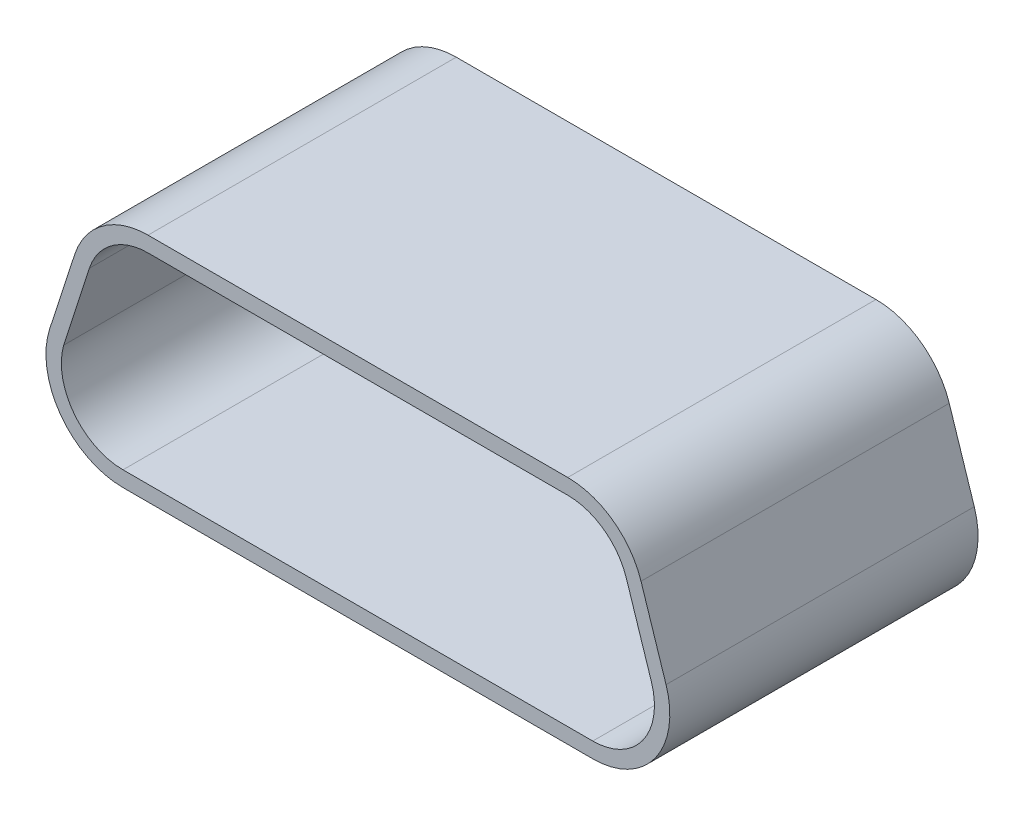
ISO-10303-21;
HEADER;
FILE_DESCRIPTION(('STEP AP214'),'2;1');
FILE_NAME('part.step','',(''),(''),'','','');
FILE_SCHEMA(('AUTOMOTIVE_DESIGN { 1 0 10303 214 1 1 1 1 }'));
ENDSEC;
DATA;
#1=APPLICATION_CONTEXT('core data for automotive mechanical design processes');
#2=APPLICATION_PROTOCOL_DEFINITION('international standard','automotive_design',2000,#1);
#3=PRODUCT_CONTEXT('',#1,'mechanical');
#4=PRODUCT('Part','Part','',(#3));
#5=PRODUCT_RELATED_PRODUCT_CATEGORY('part','',(#4));
#6=PRODUCT_DEFINITION_FORMATION('','',#4);
#7=PRODUCT_DEFINITION_CONTEXT('part definition',#1,'design');
#8=PRODUCT_DEFINITION('design','',#6,#7);
#9=PRODUCT_DEFINITION_SHAPE('','',#8);
#10=(LENGTH_UNIT() NAMED_UNIT(*) SI_UNIT(.MILLI.,.METRE.));
#11=(NAMED_UNIT(*) PLANE_ANGLE_UNIT() SI_UNIT($,.RADIAN.));
#12=(NAMED_UNIT(*) SI_UNIT($,.STERADIAN.) SOLID_ANGLE_UNIT());
#13=UNCERTAINTY_MEASURE_WITH_UNIT(LENGTH_MEASURE(1.E-05),#10,'distance_accuracy_value','');
#14=(GEOMETRIC_REPRESENTATION_CONTEXT(3) GLOBAL_UNCERTAINTY_ASSIGNED_CONTEXT((#13)) GLOBAL_UNIT_ASSIGNED_CONTEXT((#10,
#11,#12)) REPRESENTATION_CONTEXT('',''));
#15=CARTESIAN_POINT('',(0.,0.,0.));
#16=DIRECTION('',(0.,0.,1.));
#17=DIRECTION('',(1.,0.,0.));
#18=AXIS2_PLACEMENT_3D('',#15,#16,#17);
#19=CARTESIAN_POINT('',(-2.64724610187082,15.,20.));
#20=DIRECTION('',(0.,-1.,0.));
#21=DIRECTION('',(0.,0.,-1.));
#22=AXIS2_PLACEMENT_3D('',#19,#20,#21);
#23=PLANE('',#22);
#24=DIRECTION('',(-1.,0.,0.));
#25=VECTOR('',#24,1.);
#26=CARTESIAN_POINT('',(-2.64724610187082,15.,0.));
#27=LINE('',#26,#25);
#28=CARTESIAN_POINT('',(28.2190362234267,15.,0.));
#29=VERTEX_POINT('',#28);
#30=CARTESIAN_POINT('',(0.985466538155962,15.,0.));
#31=VERTEX_POINT('',#30);
#32=EDGE_CURVE('E201',#29,#31,#27,.T.);
#33=ORIENTED_EDGE('',*,*,#32,.T.);
#34=DIRECTION('',(0.,0.,-1.));
#35=VECTOR('',#34,1.);
#36=CARTESIAN_POINT('',(0.985466538155962,15.,20.));
#37=LINE('',#36,#35);
#38=CARTESIAN_POINT('',(0.985466538155962,15.,20.));
#39=VERTEX_POINT('',#38);
#40=EDGE_CURVE('E252',#31,#39,#37,.F.);
#41=ORIENTED_EDGE('',*,*,#40,.T.);
#42=DIRECTION('',(-1.,0.,0.));
#43=VECTOR('',#42,1.);
#44=CARTESIAN_POINT('',(-2.64724610187082,15.,20.));
#45=LINE('',#44,#43);
#46=CARTESIAN_POINT('',(28.2190362234267,15.,20.));
#47=VERTEX_POINT('',#46);
#48=EDGE_CURVE('E216',#47,#39,#45,.T.);
#49=ORIENTED_EDGE('',*,*,#48,.F.);
#50=DIRECTION('',(0.,0.,-1.));
#51=VECTOR('',#50,1.);
#52=CARTESIAN_POINT('',(28.2190362234267,15.,20.));
#53=LINE('',#52,#51);
#54=EDGE_CURVE('E249',#47,#29,#53,.T.);
#55=ORIENTED_EDGE('',*,*,#54,.T.);
#56=EDGE_LOOP('',(#33,#41,#49,#55));
#57=FACE_BOUND('',#56,.T.);
#58=ADVANCED_FACE('F33',(#57),#23,.F.);
#59=CARTESIAN_POINT('',(-5.89644306419994,5.,20.));
#60=DIRECTION('',(0.951056516295152,-0.309016994374952,0.));
#61=DIRECTION('',(0.309016994374952,0.951056516295152,0.));
#62=AXIS2_PLACEMENT_3D('',#59,#60,#61);
#63=PLANE('',#62);
#64=DIRECTION('',(-0.309016994374952,-0.951056516295152,0.));
#65=VECTOR('',#64,1.);
#66=CARTESIAN_POINT('',(-5.89644306419994,5.,20.));
#67=LINE('',#66,#65);
#68=CARTESIAN_POINT('',(-3.7698160433198,11.5450849718748,20.));
#69=VERTEX_POINT('',#68);
#70=CARTESIAN_POINT('',(-5.39441452448435,6.54508497187476,20.));
#71=VERTEX_POINT('',#70);
#72=EDGE_CURVE('E220',#69,#71,#67,.T.);
#73=ORIENTED_EDGE('',*,*,#72,.F.);
#74=DIRECTION('',(0.,0.,-1.));
#75=VECTOR('',#74,1.);
#76=CARTESIAN_POINT('',(-3.7698160433198,11.5450849718748,20.));
#77=LINE('',#76,#75);
#78=CARTESIAN_POINT('',(-3.7698160433198,11.5450849718748,0.));
#79=VERTEX_POINT('',#78);
#80=EDGE_CURVE('E238',#69,#79,#77,.T.);
#81=ORIENTED_EDGE('',*,*,#80,.T.);
#82=DIRECTION('',(-0.309016994374952,-0.951056516295152,0.));
#83=VECTOR('',#82,1.);
#84=CARTESIAN_POINT('',(-5.89644306419994,5.,0.));
#85=LINE('',#84,#83);
#86=CARTESIAN_POINT('',(-5.39441452448435,6.54508497187476,0.));
#87=VERTEX_POINT('',#86);
#88=EDGE_CURVE('E229',#79,#87,#85,.T.);
#89=ORIENTED_EDGE('',*,*,#88,.T.);
#90=DIRECTION('',(0.,0.,-1.));
#91=VECTOR('',#90,1.);
#92=CARTESIAN_POINT('',(-5.39441452448435,6.54508497187476,20.));
#93=LINE('',#92,#91);
#94=EDGE_CURVE('E226',#87,#71,#93,.F.);
#95=ORIENTED_EDGE('',*,*,#94,.T.);
#96=EDGE_LOOP('',(#73,#81,#89,#95));
#97=FACE_BOUND('',#96,.T.);
#98=ADVANCED_FACE('F293',(#97),#63,.F.);
#99=CARTESIAN_POINT('',(-7.52104154536449,0.,20.));
#100=DIRECTION('',(0.,1.,0.));
#101=DIRECTION('',(0.,0.,1.));
#102=AXIS2_PLACEMENT_3D('',#99,#100,#101);
#103=PLANE('',#102);
#104=DIRECTION('',(1.,0.,0.));
#105=VECTOR('',#104,1.);
#106=CARTESIAN_POINT('',(-7.52104154536449,0.,20.));
#107=LINE('',#106,#105);
#108=CARTESIAN_POINT('',(-0.639131943008595,0.,20.));
#109=VERTEX_POINT('',#108);
#110=CARTESIAN_POINT('',(29.8436347045912,0.,20.));
#111=VERTEX_POINT('',#110);
#112=EDGE_CURVE('E223',#109,#111,#107,.T.);
#113=ORIENTED_EDGE('',*,*,#112,.F.);
#114=DIRECTION('',(0.,0.,-1.));
#115=VECTOR('',#114,1.);
#116=CARTESIAN_POINT('',(-0.639131943008593,0.,20.));
#117=LINE('',#116,#115);
#118=CARTESIAN_POINT('',(-0.639131943008595,0.,0.));
#119=VERTEX_POINT('',#118);
#120=EDGE_CURVE('E264',#109,#119,#117,.T.);
#121=ORIENTED_EDGE('',*,*,#120,.T.);
#122=DIRECTION('',(1.,0.,0.));
#123=VECTOR('',#122,1.);
#124=CARTESIAN_POINT('',(-7.52104154536449,0.,0.));
#125=LINE('',#124,#123);
#126=CARTESIAN_POINT('',(29.8436347045912,0.,0.));
#127=VERTEX_POINT('',#126);
#128=EDGE_CURVE('E232',#119,#127,#125,.T.);
#129=ORIENTED_EDGE('',*,*,#128,.T.);
#130=DIRECTION('',(0.,0.,-1.));
#131=VECTOR('',#130,1.);
#132=CARTESIAN_POINT('',(29.8436347045912,0.,20.));
#133=LINE('',#132,#131);
#134=EDGE_CURVE('E262',#127,#111,#133,.F.);
#135=ORIENTED_EDGE('',*,*,#134,.T.);
#136=EDGE_LOOP('',(#113,#121,#129,#135));
#137=FACE_BOUND('',#136,.T.);
#138=ADVANCED_FACE('F301',(#137),#103,.F.);
#139=CARTESIAN_POINT('',(36.7255443069471,0.,20.));
#140=DIRECTION('',(-0.951056516295152,-0.309016994374952,0.));
#141=DIRECTION('',(0.309016994374952,-0.951056516295152,0.));
#142=AXIS2_PLACEMENT_3D('',#139,#140,#141);
#143=PLANE('',#142);
#144=DIRECTION('',(-0.309016994374952,0.951056516295152,0.));
#145=VECTOR('',#144,1.);
#146=CARTESIAN_POINT('',(36.7255443069471,0.,0.));
#147=LINE('',#146,#145);
#148=CARTESIAN_POINT('',(34.598917286067,6.54508497187476,0.));
#149=VERTEX_POINT('',#148);
#150=CARTESIAN_POINT('',(32.9743188049024,11.5450849718748,0.));
#151=VERTEX_POINT('',#150);
#152=EDGE_CURVE('E217',#149,#151,#147,.T.);
#153=ORIENTED_EDGE('',*,*,#152,.T.);
#154=DIRECTION('',(0.,0.,-1.));
#155=VECTOR('',#154,1.);
#156=CARTESIAN_POINT('',(32.9743188049024,11.5450849718748,20.));
#157=LINE('',#156,#155);
#158=CARTESIAN_POINT('',(32.9743188049024,11.5450849718748,20.));
#159=VERTEX_POINT('',#158);
#160=EDGE_CURVE('E12',#151,#159,#157,.F.);
#161=ORIENTED_EDGE('',*,*,#160,.T.);
#162=DIRECTION('',(-0.309016994374952,0.951056516295152,0.));
#163=VECTOR('',#162,1.);
#164=CARTESIAN_POINT('',(31.8517488634535,15.,20.));
#165=LINE('',#164,#163);
#166=CARTESIAN_POINT('',(34.598917286067,6.54508497187476,20.));
#167=VERTEX_POINT('',#166);
#168=EDGE_CURVE('E213',#167,#159,#165,.T.);
#169=ORIENTED_EDGE('',*,*,#168,.F.);
#170=DIRECTION('',(0.,0.,-1.));
#171=VECTOR('',#170,1.);
#172=CARTESIAN_POINT('',(34.598917286067,6.54508497187476,20.));
#173=LINE('',#172,#171);
#174=EDGE_CURVE('E41',#167,#149,#173,.T.);
#175=ORIENTED_EDGE('',*,*,#174,.T.);
#176=EDGE_LOOP('',(#153,#161,#169,#175));
#177=FACE_BOUND('',#176,.T.);
#178=ADVANCED_FACE('F271',(#177),#143,.F.);
#179=CARTESIAN_POINT('',(0.,0.,20.));
#180=DIRECTION('',(0.,0.,1.));
#181=DIRECTION('',(1.,0.,0.));
#182=AXIS2_PLACEMENT_3D('',#179,#180,#181);
#183=PLANE('',#182);
#184=DIRECTION('',(1.,0.,0.));
#185=VECTOR('',#184,1.);
#186=CARTESIAN_POINT('',(0.,1.,20.));
#187=LINE('',#186,#185);
#188=CARTESIAN_POINT('',(-0.639131943008593,1.,20.));
#189=VERTEX_POINT('',#188);
#190=CARTESIAN_POINT('',(29.8436347045912,1.,20.));
#191=VERTEX_POINT('',#190);
#192=EDGE_CURVE('E48',#189,#191,#187,.T.);
#193=ORIENTED_EDGE('',*,*,#192,.F.);
#194=CARTESIAN_POINT('',(-0.639131943008593,5.,20.));
#195=DIRECTION('',(0.,0.,1.));
#196=DIRECTION('',(1.,0.,0.));
#197=AXIS2_PLACEMENT_3D('',#194,#195,#196);
#198=CIRCLE('',#197,4.);
#199=CARTESIAN_POINT('',(-4.49189811161005,6.07526408387894,20.));
#200=VERTEX_POINT('',#199);
#201=EDGE_CURVE('E164',#200,#189,#198,.T.);
#202=ORIENTED_EDGE('',*,*,#201,.F.);
#203=DIRECTION('',(-0.308398681936527,-0.95125719601999,0.));
#204=VECTOR('',#203,1.);
#205=CARTESIAN_POINT('',(-5.84695356944735,1.89558910219665,20.));
#206=LINE('',#205,#204);
#207=CARTESIAN_POINT('',(-2.81875952702466,11.2360679774998,20.));
#208=VERTEX_POINT('',#207);
#209=EDGE_CURVE('E167',#208,#200,#206,.T.);
#210=ORIENTED_EDGE('',*,*,#209,.F.);
#211=CARTESIAN_POINT('',(0.985466538155962,10.,20.));
#212=DIRECTION('',(0.,0.,1.));
#213=DIRECTION('',(1.,0.,0.));
#214=AXIS2_PLACEMENT_3D('',#211,#212,#213);
#215=CIRCLE('',#214,4.);
#216=CARTESIAN_POINT('',(0.985466538155962,14.,20.));
#217=VERTEX_POINT('',#216);
#218=EDGE_CURVE('E194',#217,#208,#215,.T.);
#219=ORIENTED_EDGE('',*,*,#218,.F.);
#220=DIRECTION('',(1.,0.,0.));
#221=VECTOR('',#220,1.);
#222=CARTESIAN_POINT('',(0.,14.,20.));
#223=LINE('',#222,#221);
#224=CARTESIAN_POINT('',(28.2190362234267,14.,20.));
#225=VERTEX_POINT('',#224);
#226=EDGE_CURVE('E191',#217,#225,#223,.T.);
#227=ORIENTED_EDGE('',*,*,#226,.T.);
#228=CARTESIAN_POINT('',(28.2190362234267,10.,20.));
#229=DIRECTION('',(0.,0.,1.));
#230=DIRECTION('',(1.,0.,0.));
#231=AXIS2_PLACEMENT_3D('',#228,#229,#230);
#232=CIRCLE('',#231,4.);
#233=CARTESIAN_POINT('',(32.0232622886073,11.2360679774998,20.));
#234=VERTEX_POINT('',#233);
#235=EDGE_CURVE('E188',#234,#225,#232,.T.);
#236=ORIENTED_EDGE('',*,*,#235,.F.);
#237=DIRECTION('',(-0.309016994374952,0.951056516295152,0.));
#238=VECTOR('',#237,1.);
#239=CARTESIAN_POINT('',(32.2675103731735,10.4843496686439,20.));
#240=LINE('',#239,#238);
#241=CARTESIAN_POINT('',(33.6478607697718,6.23606797749981,20.));
#242=VERTEX_POINT('',#241);
#243=EDGE_CURVE('E185',#242,#234,#240,.T.);
#244=ORIENTED_EDGE('',*,*,#243,.F.);
#245=CARTESIAN_POINT('',(29.8436347045912,5.,20.));
#246=DIRECTION('',(0.,0.,1.));
#247=DIRECTION('',(1.,0.,0.));
#248=AXIS2_PLACEMENT_3D('',#245,#246,#247);
#249=CIRCLE('',#248,4.);
#250=EDGE_CURVE('E183',#191,#242,#249,.T.);
#251=ORIENTED_EDGE('',*,*,#250,.F.);
#252=EDGE_LOOP('',(#193,#202,#210,#219,#227,#236,#244,#251));
#253=FACE_BOUND('',#252,.T.);
#254=ORIENTED_EDGE('',*,*,#48,.T.);
#255=CARTESIAN_POINT('',(0.985466538155962,10.,20.));
#256=DIRECTION('',(0.,0.,1.));
#257=DIRECTION('',(1.,0.,0.));
#258=AXIS2_PLACEMENT_3D('',#255,#256,#257);
#259=CIRCLE('',#258,5.);
#260=EDGE_CURVE('E260',#39,#69,#259,.T.);
#261=ORIENTED_EDGE('',*,*,#260,.T.);
#262=ORIENTED_EDGE('',*,*,#72,.T.);
#263=CARTESIAN_POINT('',(-0.639131943008593,5.,20.));
#264=DIRECTION('',(0.,0.,1.));
#265=DIRECTION('',(1.,0.,0.));
#266=AXIS2_PLACEMENT_3D('',#263,#264,#265);
#267=CIRCLE('',#266,5.);
#268=EDGE_CURVE('E258',#71,#109,#267,.T.);
#269=ORIENTED_EDGE('',*,*,#268,.T.);
#270=ORIENTED_EDGE('',*,*,#112,.T.);
#271=CARTESIAN_POINT('',(29.8436347045912,5.,20.));
#272=DIRECTION('',(0.,0.,1.));
#273=DIRECTION('',(1.,0.,0.));
#274=AXIS2_PLACEMENT_3D('',#271,#272,#273);
#275=CIRCLE('',#274,5.);
#276=EDGE_CURVE('E254',#111,#167,#275,.T.);
#277=ORIENTED_EDGE('',*,*,#276,.T.);
#278=ORIENTED_EDGE('',*,*,#168,.T.);
#279=CARTESIAN_POINT('',(28.2190362234267,10.,20.));
#280=DIRECTION('',(0.,0.,1.));
#281=DIRECTION('',(1.,0.,0.));
#282=AXIS2_PLACEMENT_3D('',#279,#280,#281);
#283=CIRCLE('',#282,5.);
#284=EDGE_CURVE('E256',#159,#47,#283,.T.);
#285=ORIENTED_EDGE('',*,*,#284,.T.);
#286=EDGE_LOOP('',(#254,#261,#262,#269,#270,#277,#278,#285));
#287=FACE_BOUND('',#286,.T.);
#288=ADVANCED_FACE('F287',(#253,#287),#183,.T.);
#289=CARTESIAN_POINT('',(0.,0.,0.));
#290=DIRECTION('',(0.,0.,1.));
#291=DIRECTION('',(1.,0.,0.));
#292=AXIS2_PLACEMENT_3D('',#289,#290,#291);
#293=PLANE('',#292);
#294=CARTESIAN_POINT('',(-0.639131943008593,5.,0.));
#295=DIRECTION('',(0.,0.,1.));
#296=DIRECTION('',(1.,0.,0.));
#297=AXIS2_PLACEMENT_3D('',#294,#295,#296);
#298=CIRCLE('',#297,4.);
#299=CARTESIAN_POINT('',(-4.49189811161005,6.07526408387894,0.));
#300=VERTEX_POINT('',#299);
#301=CARTESIAN_POINT('',(-0.639131943008593,1.,0.));
#302=VERTEX_POINT('',#301);
#303=EDGE_CURVE('E153',#300,#302,#298,.T.);
#304=ORIENTED_EDGE('',*,*,#303,.T.);
#305=DIRECTION('',(1.,0.,0.));
#306=VECTOR('',#305,1.);
#307=CARTESIAN_POINT('',(0.,1.,0.));
#308=LINE('',#307,#306);
#309=CARTESIAN_POINT('',(29.8436347045912,1.,0.));
#310=VERTEX_POINT('',#309);
#311=EDGE_CURVE('E147',#302,#310,#308,.T.);
#312=ORIENTED_EDGE('',*,*,#311,.T.);
#313=CARTESIAN_POINT('',(29.8436347045912,5.,0.));
#314=DIRECTION('',(0.,0.,1.));
#315=DIRECTION('',(1.,0.,0.));
#316=AXIS2_PLACEMENT_3D('',#313,#314,#315);
#317=CIRCLE('',#316,4.);
#318=CARTESIAN_POINT('',(33.6478607697718,6.23606797749981,0.));
#319=VERTEX_POINT('',#318);
#320=EDGE_CURVE('E156',#310,#319,#317,.T.);
#321=ORIENTED_EDGE('',*,*,#320,.T.);
#322=DIRECTION('',(-0.309016994374952,0.951056516295152,0.));
#323=VECTOR('',#322,1.);
#324=CARTESIAN_POINT('',(32.2675103731735,10.4843496686439,0.));
#325=LINE('',#324,#323);
#326=CARTESIAN_POINT('',(32.0232622886073,11.2360679774998,0.));
#327=VERTEX_POINT('',#326);
#328=EDGE_CURVE('E56',#319,#327,#325,.T.);
#329=ORIENTED_EDGE('',*,*,#328,.T.);
#330=CARTESIAN_POINT('',(28.2190362234267,10.,0.));
#331=DIRECTION('',(0.,0.,1.));
#332=DIRECTION('',(1.,0.,0.));
#333=AXIS2_PLACEMENT_3D('',#330,#331,#332);
#334=CIRCLE('',#333,4.);
#335=CARTESIAN_POINT('',(28.2190362234267,14.,0.));
#336=VERTEX_POINT('',#335);
#337=EDGE_CURVE('E171',#327,#336,#334,.T.);
#338=ORIENTED_EDGE('',*,*,#337,.T.);
#339=DIRECTION('',(1.,0.,0.));
#340=VECTOR('',#339,1.);
#341=CARTESIAN_POINT('',(0.,14.,0.));
#342=LINE('',#341,#340);
#343=CARTESIAN_POINT('',(0.985466538155962,14.,0.));
#344=VERTEX_POINT('',#343);
#345=EDGE_CURVE('E174',#344,#336,#342,.T.);
#346=ORIENTED_EDGE('',*,*,#345,.F.);
#347=CARTESIAN_POINT('',(0.985466538155962,10.,0.));
#348=DIRECTION('',(0.,0.,1.));
#349=DIRECTION('',(1.,0.,0.));
#350=AXIS2_PLACEMENT_3D('',#347,#348,#349);
#351=CIRCLE('',#350,4.);
#352=CARTESIAN_POINT('',(-2.81875952702466,11.2360679774998,0.));
#353=VERTEX_POINT('',#352);
#354=EDGE_CURVE('E176',#344,#353,#351,.T.);
#355=ORIENTED_EDGE('',*,*,#354,.T.);
#356=DIRECTION('',(-0.308398681936527,-0.95125719601999,0.));
#357=VECTOR('',#356,1.);
#358=CARTESIAN_POINT('',(-5.84695356944735,1.89558910219665,0.));
#359=LINE('',#358,#357);
#360=EDGE_CURVE('E179',#353,#300,#359,.T.);
#361=ORIENTED_EDGE('',*,*,#360,.T.);
#362=EDGE_LOOP('',(#304,#312,#321,#329,#338,#346,#355,#361));
#363=FACE_BOUND('',#362,.T.);
#364=ORIENTED_EDGE('',*,*,#88,.F.);
#365=CARTESIAN_POINT('',(0.985466538155962,10.,0.));
#366=DIRECTION('',(0.,0.,1.));
#367=DIRECTION('',(1.,0.,0.));
#368=AXIS2_PLACEMENT_3D('',#365,#366,#367);
#369=CIRCLE('',#368,5.);
#370=EDGE_CURVE('E247',#79,#31,#369,.F.);
#371=ORIENTED_EDGE('',*,*,#370,.T.);
#372=ORIENTED_EDGE('',*,*,#32,.F.);
#373=CARTESIAN_POINT('',(28.2190362234267,10.,0.));
#374=DIRECTION('',(0.,0.,1.));
#375=DIRECTION('',(1.,0.,0.));
#376=AXIS2_PLACEMENT_3D('',#373,#374,#375);
#377=CIRCLE('',#376,5.);
#378=EDGE_CURVE('E243',#29,#151,#377,.F.);
#379=ORIENTED_EDGE('',*,*,#378,.T.);
#380=ORIENTED_EDGE('',*,*,#152,.F.);
#381=CARTESIAN_POINT('',(29.8436347045912,5.,0.));
#382=DIRECTION('',(0.,0.,1.));
#383=DIRECTION('',(1.,0.,0.));
#384=AXIS2_PLACEMENT_3D('',#381,#382,#383);
#385=CIRCLE('',#384,5.);
#386=EDGE_CURVE('E241',#149,#127,#385,.F.);
#387=ORIENTED_EDGE('',*,*,#386,.T.);
#388=ORIENTED_EDGE('',*,*,#128,.F.);
#389=CARTESIAN_POINT('',(-0.639131943008593,5.,0.));
#390=DIRECTION('',(0.,0.,1.));
#391=DIRECTION('',(1.,0.,0.));
#392=AXIS2_PLACEMENT_3D('',#389,#390,#391);
#393=CIRCLE('',#392,5.);
#394=EDGE_CURVE('E245',#119,#87,#393,.F.);
#395=ORIENTED_EDGE('',*,*,#394,.T.);
#396=EDGE_LOOP('',(#364,#371,#372,#379,#380,#387,#388,#395));
#397=FACE_BOUND('',#396,.T.);
#398=ADVANCED_FACE('F160',(#363,#397),#293,.F.);
#399=CARTESIAN_POINT('',(0.985466538155962,10.,20.));
#400=DIRECTION('',(0.,0.,-1.));
#401=DIRECTION('',(-1.,0.,0.));
#402=AXIS2_PLACEMENT_3D('',#399,#400,#401);
#403=CYLINDRICAL_SURFACE('',#402,5.);
#404=ORIENTED_EDGE('',*,*,#260,.F.);
#405=ORIENTED_EDGE('',*,*,#40,.F.);
#406=ORIENTED_EDGE('',*,*,#370,.F.);
#407=ORIENTED_EDGE('',*,*,#80,.F.);
#408=EDGE_LOOP('',(#404,#405,#406,#407));
#409=FACE_BOUND('',#408,.T.);
#410=ADVANCED_FACE('F291',(#409),#403,.T.);
#411=CARTESIAN_POINT('',(-0.639131943008593,5.,20.));
#412=DIRECTION('',(0.,0.,-1.));
#413=DIRECTION('',(-1.,0.,0.));
#414=AXIS2_PLACEMENT_3D('',#411,#412,#413);
#415=CYLINDRICAL_SURFACE('',#414,5.);
#416=ORIENTED_EDGE('',*,*,#268,.F.);
#417=ORIENTED_EDGE('',*,*,#94,.F.);
#418=ORIENTED_EDGE('',*,*,#394,.F.);
#419=ORIENTED_EDGE('',*,*,#120,.F.);
#420=EDGE_LOOP('',(#416,#417,#418,#419));
#421=FACE_BOUND('',#420,.T.);
#422=ADVANCED_FACE('F298',(#421),#415,.T.);
#423=CARTESIAN_POINT('',(28.2190362234267,10.,20.));
#424=DIRECTION('',(0.,0.,-1.));
#425=DIRECTION('',(-1.,0.,0.));
#426=AXIS2_PLACEMENT_3D('',#423,#424,#425);
#427=CYLINDRICAL_SURFACE('',#426,5.);
#428=ORIENTED_EDGE('',*,*,#284,.F.);
#429=ORIENTED_EDGE('',*,*,#160,.F.);
#430=ORIENTED_EDGE('',*,*,#378,.F.);
#431=ORIENTED_EDGE('',*,*,#54,.F.);
#432=EDGE_LOOP('',(#428,#429,#430,#431));
#433=FACE_BOUND('',#432,.T.);
#434=ADVANCED_FACE('F281',(#433),#427,.T.);
#435=CARTESIAN_POINT('',(29.8436347045912,5.,20.));
#436=DIRECTION('',(0.,0.,-1.));
#437=DIRECTION('',(-1.,0.,0.));
#438=AXIS2_PLACEMENT_3D('',#435,#436,#437);
#439=CYLINDRICAL_SURFACE('',#438,5.);
#440=ORIENTED_EDGE('',*,*,#276,.F.);
#441=ORIENTED_EDGE('',*,*,#134,.F.);
#442=ORIENTED_EDGE('',*,*,#386,.F.);
#443=ORIENTED_EDGE('',*,*,#174,.F.);
#444=EDGE_LOOP('',(#440,#441,#442,#443));
#445=FACE_BOUND('',#444,.T.);
#446=ADVANCED_FACE('F35',(#445),#439,.T.);
#447=CARTESIAN_POINT('',(0.,1.,0.));
#448=DIRECTION('',(0.,-1.,0.));
#449=DIRECTION('',(1.,0.,0.));
#450=AXIS2_PLACEMENT_3D('',#447,#448,#449);
#451=PLANE('',#450);
#452=ORIENTED_EDGE('',*,*,#192,.T.);
#453=DIRECTION('',(0.,0.,1.));
#454=VECTOR('',#453,1.);
#455=CARTESIAN_POINT('',(29.8436347045912,1.,0.));
#456=LINE('',#455,#454);
#457=EDGE_CURVE('E143',#310,#191,#456,.T.);
#458=ORIENTED_EDGE('',*,*,#457,.F.);
#459=ORIENTED_EDGE('',*,*,#311,.F.);
#460=DIRECTION('',(0.,0.,1.));
#461=VECTOR('',#460,1.);
#462=CARTESIAN_POINT('',(-0.639131943008593,1.,0.));
#463=LINE('',#462,#461);
#464=EDGE_CURVE('E199',#302,#189,#463,.T.);
#465=ORIENTED_EDGE('',*,*,#464,.T.);
#466=EDGE_LOOP('',(#452,#458,#459,#465));
#467=FACE_BOUND('',#466,.T.);
#468=ADVANCED_FACE('F145',(#467),#451,.F.);
#469=CARTESIAN_POINT('',(-0.639131943008593,5.,0.));
#470=DIRECTION('',(0.,0.,1.));
#471=DIRECTION('',(1.,0.,0.));
#472=AXIS2_PLACEMENT_3D('',#469,#470,#471);
#473=CYLINDRICAL_SURFACE('',#472,4.);
#474=ORIENTED_EDGE('',*,*,#201,.T.);
#475=ORIENTED_EDGE('',*,*,#464,.F.);
#476=ORIENTED_EDGE('',*,*,#303,.F.);
#477=DIRECTION('',(0.,0.,1.));
#478=VECTOR('',#477,1.);
#479=CARTESIAN_POINT('',(-4.49189811161005,6.07526408387894,0.));
#480=LINE('',#479,#478);
#481=EDGE_CURVE('E202',#300,#200,#480,.T.);
#482=ORIENTED_EDGE('',*,*,#481,.T.);
#483=EDGE_LOOP('',(#474,#475,#476,#482));
#484=FACE_BOUND('',#483,.T.);
#485=ADVANCED_FACE('F308',(#484),#473,.F.);
#486=CARTESIAN_POINT('',(-5.84695356944735,1.89558910219665,0.));
#487=DIRECTION('',(-0.95125719601999,0.308398681936526,0.));
#488=DIRECTION('',(-0.308398681936526,-0.95125719601999,0.));
#489=AXIS2_PLACEMENT_3D('',#486,#487,#488);
#490=PLANE('',#489);
#491=ORIENTED_EDGE('',*,*,#209,.T.);
#492=ORIENTED_EDGE('',*,*,#481,.F.);
#493=ORIENTED_EDGE('',*,*,#360,.F.);
#494=DIRECTION('',(0.,0.,1.));
#495=VECTOR('',#494,1.);
#496=CARTESIAN_POINT('',(-2.81875952702466,11.2360679774998,0.));
#497=LINE('',#496,#495);
#498=EDGE_CURVE('E204',#353,#208,#497,.T.);
#499=ORIENTED_EDGE('',*,*,#498,.T.);
#500=EDGE_LOOP('',(#491,#492,#493,#499));
#501=FACE_BOUND('',#500,.T.);
#502=ADVANCED_FACE('F362',(#501),#490,.F.);
#503=CARTESIAN_POINT('',(0.985466538155962,10.,0.));
#504=DIRECTION('',(0.,0.,1.));
#505=DIRECTION('',(1.,0.,0.));
#506=AXIS2_PLACEMENT_3D('',#503,#504,#505);
#507=CYLINDRICAL_SURFACE('',#506,4.);
#508=ORIENTED_EDGE('',*,*,#218,.T.);
#509=ORIENTED_EDGE('',*,*,#498,.F.);
#510=ORIENTED_EDGE('',*,*,#354,.F.);
#511=DIRECTION('',(0.,0.,1.));
#512=VECTOR('',#511,1.);
#513=CARTESIAN_POINT('',(0.985466538155962,14.,0.));
#514=LINE('',#513,#512);
#515=EDGE_CURVE('E206',#344,#217,#514,.T.);
#516=ORIENTED_EDGE('',*,*,#515,.T.);
#517=EDGE_LOOP('',(#508,#509,#510,#516));
#518=FACE_BOUND('',#517,.T.);
#519=ADVANCED_FACE('F373',(#518),#507,.F.);
#520=CARTESIAN_POINT('',(0.,14.,0.));
#521=DIRECTION('',(0.,-1.,0.));
#522=DIRECTION('',(0.,0.,-1.));
#523=AXIS2_PLACEMENT_3D('',#520,#521,#522);
#524=PLANE('',#523);
#525=ORIENTED_EDGE('',*,*,#226,.F.);
#526=ORIENTED_EDGE('',*,*,#515,.F.);
#527=ORIENTED_EDGE('',*,*,#345,.T.);
#528=DIRECTION('',(0.,0.,1.));
#529=VECTOR('',#528,1.);
#530=CARTESIAN_POINT('',(28.2190362234267,14.,0.));
#531=LINE('',#530,#529);
#532=EDGE_CURVE('E208',#336,#225,#531,.T.);
#533=ORIENTED_EDGE('',*,*,#532,.T.);
#534=EDGE_LOOP('',(#525,#526,#527,#533));
#535=FACE_BOUND('',#534,.T.);
#536=ADVANCED_FACE('F383',(#535),#524,.T.);
#537=CARTESIAN_POINT('',(28.2190362234267,10.,0.));
#538=DIRECTION('',(0.,0.,1.));
#539=DIRECTION('',(1.,0.,0.));
#540=AXIS2_PLACEMENT_3D('',#537,#538,#539);
#541=CYLINDRICAL_SURFACE('',#540,4.);
#542=ORIENTED_EDGE('',*,*,#235,.T.);
#543=ORIENTED_EDGE('',*,*,#532,.F.);
#544=ORIENTED_EDGE('',*,*,#337,.F.);
#545=DIRECTION('',(0.,0.,1.));
#546=VECTOR('',#545,1.);
#547=CARTESIAN_POINT('',(32.0232622886073,11.2360679774998,0.));
#548=LINE('',#547,#546);
#549=EDGE_CURVE('E210',#327,#234,#548,.T.);
#550=ORIENTED_EDGE('',*,*,#549,.T.);
#551=EDGE_LOOP('',(#542,#543,#544,#550));
#552=FACE_BOUND('',#551,.T.);
#553=ADVANCED_FACE('F393',(#552),#541,.F.);
#554=CARTESIAN_POINT('',(32.2675103731735,10.4843496686439,0.));
#555=DIRECTION('',(0.951056516295152,0.309016994374952,0.));
#556=DIRECTION('',(-0.309016994374952,0.951056516295152,0.));
#557=AXIS2_PLACEMENT_3D('',#554,#555,#556);
#558=PLANE('',#557);
#559=ORIENTED_EDGE('',*,*,#243,.T.);
#560=ORIENTED_EDGE('',*,*,#549,.F.);
#561=ORIENTED_EDGE('',*,*,#328,.F.);
#562=DIRECTION('',(0.,0.,1.));
#563=VECTOR('',#562,1.);
#564=CARTESIAN_POINT('',(33.6478607697718,6.23606797749981,0.));
#565=LINE('',#564,#563);
#566=EDGE_CURVE('E152',#319,#242,#565,.T.);
#567=ORIENTED_EDGE('',*,*,#566,.T.);
#568=EDGE_LOOP('',(#559,#560,#561,#567));
#569=FACE_BOUND('',#568,.T.);
#570=ADVANCED_FACE('F403',(#569),#558,.F.);
#571=CARTESIAN_POINT('',(29.8436347045912,5.,0.));
#572=DIRECTION('',(0.,0.,1.));
#573=DIRECTION('',(1.,0.,0.));
#574=AXIS2_PLACEMENT_3D('',#571,#572,#573);
#575=CYLINDRICAL_SURFACE('',#574,4.);
#576=ORIENTED_EDGE('',*,*,#250,.T.);
#577=ORIENTED_EDGE('',*,*,#566,.F.);
#578=ORIENTED_EDGE('',*,*,#320,.F.);
#579=ORIENTED_EDGE('',*,*,#457,.T.);
#580=EDGE_LOOP('',(#576,#577,#578,#579));
#581=FACE_BOUND('',#580,.T.);
#582=ADVANCED_FACE('F157',(#581),#575,.F.);
#583=CLOSED_SHELL('',(#58,#98,#138,#178,#288,#398,#410,#422,#434,#446,#468,#485,#502,#519,#536,
#553,#570,#582));
#584=MANIFOLD_SOLID_BREP('B2',#583);
#585=ADVANCED_BREP_SHAPE_REPRESENTATION('',(#18,#584),#14);
#586=SHAPE_DEFINITION_REPRESENTATION(#9,#585);
ENDSEC;
END-ISO-10303-21;
